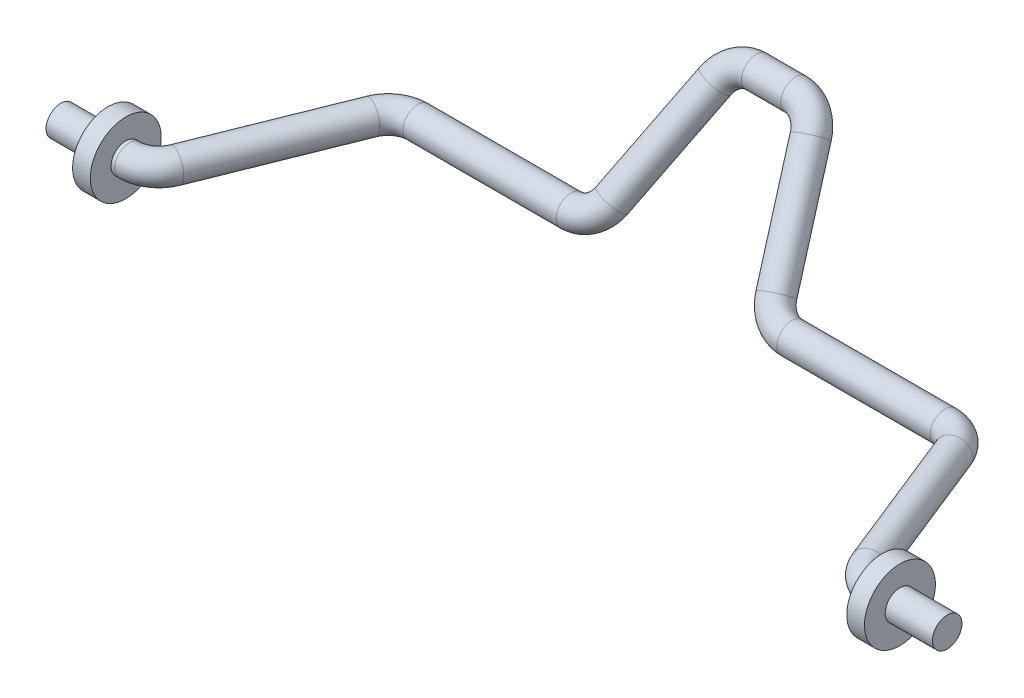
ISO-10303-21;
HEADER;
FILE_DESCRIPTION(('STEP AP214'),'2;1');
FILE_NAME('part.step','',(''),(''),'','','');
FILE_SCHEMA(('AUTOMOTIVE_DESIGN { 1 0 10303 214 1 1 1 1 }'));
ENDSEC;
DATA;
#1=APPLICATION_CONTEXT('core data for automotive mechanical design processes');
#2=APPLICATION_PROTOCOL_DEFINITION('international standard','automotive_design',2000,#1);
#3=PRODUCT_CONTEXT('',#1,'mechanical');
#4=PRODUCT('Part','Part','',(#3));
#5=PRODUCT_RELATED_PRODUCT_CATEGORY('part','',(#4));
#6=PRODUCT_DEFINITION_FORMATION('','',#4);
#7=PRODUCT_DEFINITION_CONTEXT('part definition',#1,'design');
#8=PRODUCT_DEFINITION('design','',#6,#7);
#9=PRODUCT_DEFINITION_SHAPE('','',#8);
#10=(LENGTH_UNIT() NAMED_UNIT(*) SI_UNIT(.MILLI.,.METRE.));
#11=(NAMED_UNIT(*) PLANE_ANGLE_UNIT() SI_UNIT($,.RADIAN.));
#12=(NAMED_UNIT(*) SI_UNIT($,.STERADIAN.) SOLID_ANGLE_UNIT());
#13=UNCERTAINTY_MEASURE_WITH_UNIT(LENGTH_MEASURE(1.E-05),#10,'distance_accuracy_value','');
#14=(GEOMETRIC_REPRESENTATION_CONTEXT(3) GLOBAL_UNCERTAINTY_ASSIGNED_CONTEXT((#13)) GLOBAL_UNIT_ASSIGNED_CONTEXT((#10,
#11,#12)) REPRESENTATION_CONTEXT('',''));
#15=CARTESIAN_POINT('',(0.,0.,0.));
#16=DIRECTION('',(0.,0.,1.));
#17=DIRECTION('',(1.,0.,0.));
#18=AXIS2_PLACEMENT_3D('',#15,#16,#17);
#19=CARTESIAN_POINT('',(-63.3851648071345,0.,30.));
#20=DIRECTION('',(-1.,0.,0.));
#21=DIRECTION('',(0.,0.,1.));
#22=AXIS2_PLACEMENT_3D('',#19,#20,#21);
#23=CYLINDRICAL_SURFACE('',#22,2.5);
#24=CARTESIAN_POINT('',(-63.3851648071345,0.,30.));
#25=DIRECTION('',(1.,0.,0.));
#26=DIRECTION('',(0.,0.,-1.));
#27=AXIS2_PLACEMENT_3D('',#24,#25,#26);
#28=CIRCLE('',#27,2.5);
#29=CARTESIAN_POINT('',(-63.3851648071345,0.,32.5));
#30=VERTEX_POINT('',#29);
#31=EDGE_CURVE('E50',#30,#30,#28,.T.);
#32=ORIENTED_EDGE('',*,*,#31,.F.);
#33=EDGE_LOOP('',(#32));
#34=FACE_BOUND('',#33,.T.);
#35=CARTESIAN_POINT('',(-64.,0.,30.));
#36=DIRECTION('',(-1.,0.,0.));
#37=DIRECTION('',(0.,0.,1.));
#38=AXIS2_PLACEMENT_3D('',#35,#36,#37);
#39=CIRCLE('',#38,2.5);
#40=CARTESIAN_POINT('',(-64.,0.,32.5));
#41=VERTEX_POINT('',#40);
#42=EDGE_CURVE('E10',#41,#41,#39,.T.);
#43=ORIENTED_EDGE('',*,*,#42,.F.);
#44=EDGE_LOOP('',(#43));
#45=FACE_BOUND('',#44,.T.);
#46=ADVANCED_FACE('F37',(#34,#45),#23,.T.);
#47=CARTESIAN_POINT('',(0.,20.,-16.));
#48=DIRECTION('',(-1.,0.,0.));
#49=DIRECTION('',(0.,0.,1.));
#50=AXIS2_PLACEMENT_3D('',#47,#48,#49);
#51=CYLINDRICAL_SURFACE('',#50,2.5);
#52=CARTESIAN_POINT('',(-3.32351040061422,20.,-16.));
#53=DIRECTION('',(1.,0.,0.));
#54=DIRECTION('',(0.,0.,-1.));
#55=AXIS2_PLACEMENT_3D('',#52,#53,#54);
#56=CIRCLE('',#55,2.5);
#57=CARTESIAN_POINT('',(-3.32351040061422,21.9521720236076,-17.5617376188861));
#58=VERTEX_POINT('',#57);
#59=EDGE_CURVE('E62',#58,#58,#56,.T.);
#60=ORIENTED_EDGE('',*,*,#59,.T.);
#61=EDGE_LOOP('',(#60));
#62=FACE_BOUND('',#61,.T.);
#63=CARTESIAN_POINT('',(3.32351040061422,20.,-16.));
#64=DIRECTION('',(1.,0.,0.));
#65=DIRECTION('',(0.,0.,-1.));
#66=AXIS2_PLACEMENT_3D('',#63,#64,#65);
#67=CIRCLE('',#66,2.5);
#68=CARTESIAN_POINT('',(3.32351040061422,21.9521720236076,-17.5617376188861));
#69=VERTEX_POINT('',#68);
#70=EDGE_CURVE('E190',#69,#69,#67,.T.);
#71=ORIENTED_EDGE('',*,*,#70,.F.);
#72=EDGE_LOOP('',(#71));
#73=FACE_BOUND('',#72,.T.);
#74=ADVANCED_FACE('F119',(#62,#73),#51,.T.);
#75=CARTESIAN_POINT('',(-3.32351040061422,16.0956559527848,-12.8765247622279));
#76=DIRECTION('',(0.,0.624695047554424,0.78086880944303));
#77=DIRECTION('',(0.,-0.78086880944303,0.624695047554424));
#78=AXIS2_PLACEMENT_3D('',#75,#76,#77);
#79=TOROIDAL_SURFACE('',#78,5.,2.5);
#80=CARTESIAN_POINT('',(-8.09611742170634,17.2597064457341,-13.8077651565873));
#81=DIRECTION('',(0.298142396999972,0.74535599249993,-0.596284793999944));
#82=DIRECTION('',(-0.596284793999944,-0.342369562439038,-0.72610435004877));
#83=AXIS2_PLACEMENT_3D('',#80,#81,#82);
#84=CIRCLE('',#83,2.5);
#85=CARTESIAN_POINT('',(-10.4824209322524,17.8417316922088,-14.273385353767));
#86=VERTEX_POINT('',#85);
#87=EDGE_CURVE('E69',#86,#86,#84,.T.);
#88=CARTESIAN_POINT('',(-3.32351040061422,16.0956559527848,-12.8765247622279));
#89=DIRECTION('',(0.,0.624695047554424,0.78086880944303));
#90=DIRECTION('',(0.,-0.78086880944303,0.624695047554424));
#91=AXIS2_PLACEMENT_3D('',#88,#89,#90);
#92=CIRCLE('',#91,7.5);
#93=EDGE_CURVE('',#58,#86,#92,.T.);
#94=ORIENTED_EDGE('',*,*,#59,.F.);
#95=ORIENTED_EDGE('',*,*,#87,.T.);
#96=ORIENTED_EDGE('',*,*,#93,.T.);
#97=ORIENTED_EDGE('',*,*,#93,.F.);
#98=EDGE_LOOP('',(#94,#96,#95,#97));
#99=FACE_BOUND('',#98,.T.);
#100=ADVANCED_FACE('F128',(#99),#79,.T.);
#101=CARTESIAN_POINT('',(-8.09611742170634,17.2597064457341,-13.8077651565873));
#102=DIRECTION('',(-0.298142396999972,-0.74535599249993,0.596284793999944));
#103=DIRECTION('',(0.,-0.624695047554424,-0.78086880944303));
#104=AXIS2_PLACEMENT_3D('',#101,#102,#103);
#105=CYLINDRICAL_SURFACE('',#104,2.5);
#106=CARTESIAN_POINT('',(-13.9038825782937,2.74029355426586,-2.19223484341268));
#107=DIRECTION('',(0.298142396999972,0.74535599249993,-0.596284793999944));
#108=DIRECTION('',(-0.596284793999944,-0.342369562439038,-0.72610435004877));
#109=AXIS2_PLACEMENT_3D('',#106,#107,#108);
#110=CIRCLE('',#109,2.5);
#111=CARTESIAN_POINT('',(-11.5175790677476,2.15826830779121,-1.72661464623297));
#112=VERTEX_POINT('',#111);
#113=EDGE_CURVE('E86',#112,#112,#110,.T.);
#114=ORIENTED_EDGE('',*,*,#113,.T.);
#115=EDGE_LOOP('',(#114));
#116=FACE_BOUND('',#115,.T.);
#117=ORIENTED_EDGE('',*,*,#87,.F.);
#118=EDGE_LOOP('',(#117));
#119=FACE_BOUND('',#118,.T.);
#120=ADVANCED_FACE('F159',(#116,#119),#105,.T.);
#121=CARTESIAN_POINT('',(-18.6764895993858,3.90434404721515,-3.12347523777212));
#122=DIRECTION('',(0.,-0.624695047554424,-0.78086880944303));
#123=DIRECTION('',(0.,0.78086880944303,-0.624695047554424));
#124=AXIS2_PLACEMENT_3D('',#121,#122,#123);
#125=TOROIDAL_SURFACE('',#124,5.,2.5);
#126=CARTESIAN_POINT('',(-18.6764895993858,0.,0.));
#127=DIRECTION('',(1.,0.,0.));
#128=DIRECTION('',(0.,0.,-1.));
#129=AXIS2_PLACEMENT_3D('',#126,#127,#128);
#130=CIRCLE('',#129,2.5);
#131=CARTESIAN_POINT('',(-18.6764895993857,-1.95217202360757,1.56173761888606));
#132=VERTEX_POINT('',#131);
#133=EDGE_CURVE('E90',#132,#132,#130,.T.);
#134=CARTESIAN_POINT('',(-18.6764895993858,3.90434404721515,-3.12347523777212));
#135=DIRECTION('',(0.,-0.624695047554424,-0.78086880944303));
#136=DIRECTION('',(0.,0.78086880944303,-0.624695047554424));
#137=AXIS2_PLACEMENT_3D('',#134,#135,#136);
#138=CIRCLE('',#137,7.5);
#139=EDGE_CURVE('',#112,#132,#138,.T.);
#140=ORIENTED_EDGE('',*,*,#113,.F.);
#141=ORIENTED_EDGE('',*,*,#133,.T.);
#142=ORIENTED_EDGE('',*,*,#139,.T.);
#143=ORIENTED_EDGE('',*,*,#139,.F.);
#144=EDGE_LOOP('',(#140,#142,#141,#143));
#145=FACE_BOUND('',#144,.T.);
#146=ADVANCED_FACE('F163',(#145),#125,.T.);
#147=CARTESIAN_POINT('',(-18.6764895993858,0.,0.));
#148=DIRECTION('',(-1.,0.,0.));
#149=DIRECTION('',(0.,0.,1.));
#150=AXIS2_PLACEMENT_3D('',#147,#148,#149);
#151=CYLINDRICAL_SURFACE('',#150,2.5);
#152=CARTESIAN_POINT('',(-44.6148351928655,0.,0.));
#153=DIRECTION('',(1.,0.,0.));
#154=DIRECTION('',(0.,0.,-1.));
#155=AXIS2_PLACEMENT_3D('',#152,#153,#154);
#156=CIRCLE('',#155,2.5);
#157=CARTESIAN_POINT('',(-44.6148351928655,0.,-2.5));
#158=VERTEX_POINT('',#157);
#159=EDGE_CURVE('E94',#158,#158,#156,.T.);
#160=ORIENTED_EDGE('',*,*,#159,.T.);
#161=EDGE_LOOP('',(#160));
#162=FACE_BOUND('',#161,.T.);
#163=ORIENTED_EDGE('',*,*,#133,.F.);
#164=EDGE_LOOP('',(#163));
#165=FACE_BOUND('',#164,.T.);
#166=ADVANCED_FACE('F167',(#162,#165),#151,.T.);
#167=CARTESIAN_POINT('',(-44.6148351928655,0.,5.));
#168=DIRECTION('',(0.,1.,0.));
#169=DIRECTION('',(0.,0.,1.));
#170=AXIS2_PLACEMENT_3D('',#167,#168,#169);
#171=TOROIDAL_SURFACE('',#170,5.,2.5);
#172=CARTESIAN_POINT('',(-49.2572186472918,0.,3.14304661822948));
#173=DIRECTION('',(0.371390676354103,0.,-0.92847669088526));
#174=DIRECTION('',(-0.92847669088526,0.,-0.371390676354103));
#175=AXIS2_PLACEMENT_3D('',#172,#173,#174);
#176=CIRCLE('',#175,2.5);
#177=CARTESIAN_POINT('',(-51.5784103745049,0.,2.21456992734422));
#178=VERTEX_POINT('',#177);
#179=EDGE_CURVE('E98',#178,#178,#176,.T.);
#180=CARTESIAN_POINT('',(-44.6148351928655,0.,5.));
#181=DIRECTION('',(0.,1.,0.));
#182=DIRECTION('',(0.,0.,1.));
#183=AXIS2_PLACEMENT_3D('',#180,#181,#182);
#184=CIRCLE('',#183,7.5);
#185=EDGE_CURVE('',#158,#178,#184,.T.);
#186=ORIENTED_EDGE('',*,*,#159,.F.);
#187=ORIENTED_EDGE('',*,*,#179,.T.);
#188=ORIENTED_EDGE('',*,*,#185,.T.);
#189=ORIENTED_EDGE('',*,*,#185,.F.);
#190=EDGE_LOOP('',(#186,#188,#187,#189));
#191=FACE_BOUND('',#190,.T.);
#192=ADVANCED_FACE('F120',(#191),#171,.T.);
#193=CARTESIAN_POINT('',(-49.2572186472918,0.,3.14304661822949));
#194=DIRECTION('',(-0.371390676354104,0.,0.928476690885259));
#195=DIRECTION('',(0.928476690885259,0.,0.371390676354104));
#196=AXIS2_PLACEMENT_3D('',#193,#194,#195);
#197=CYLINDRICAL_SURFACE('',#196,2.5);
#198=CARTESIAN_POINT('',(-58.7427813527082,0.,26.8569533817705));
#199=DIRECTION('',(0.371390676354104,0.,-0.928476690885259));
#200=DIRECTION('',(-0.928476690885259,0.,-0.371390676354104));
#201=AXIS2_PLACEMENT_3D('',#198,#199,#200);
#202=CIRCLE('',#201,2.5);
#203=CARTESIAN_POINT('',(-56.4215896254951,0.,27.7854300726558));
#204=VERTEX_POINT('',#203);
#205=EDGE_CURVE('E56',#204,#204,#202,.T.);
#206=ORIENTED_EDGE('',*,*,#205,.T.);
#207=EDGE_LOOP('',(#206));
#208=FACE_BOUND('',#207,.T.);
#209=ORIENTED_EDGE('',*,*,#179,.F.);
#210=EDGE_LOOP('',(#209));
#211=FACE_BOUND('',#210,.T.);
#212=ADVANCED_FACE('F105',(#208,#211),#197,.T.);
#213=CARTESIAN_POINT('',(-63.3851648071345,0.,25.));
#214=DIRECTION('',(0.,-1.,0.));
#215=DIRECTION('',(0.,0.,-1.));
#216=AXIS2_PLACEMENT_3D('',#213,#214,#215);
#217=TOROIDAL_SURFACE('',#216,4.99999999999999,2.5);
#218=CARTESIAN_POINT('',(-63.3851648071345,0.,25.));
#219=DIRECTION('',(0.,-1.,0.));
#220=DIRECTION('',(0.,0.,-1.));
#221=AXIS2_PLACEMENT_3D('',#218,#219,#220);
#222=CIRCLE('',#221,7.49999999999999);
#223=EDGE_CURVE('',#204,#30,#222,.T.);
#224=ORIENTED_EDGE('',*,*,#205,.F.);
#225=ORIENTED_EDGE('',*,*,#31,.T.);
#226=ORIENTED_EDGE('',*,*,#223,.T.);
#227=ORIENTED_EDGE('',*,*,#223,.F.);
#228=EDGE_LOOP('',(#224,#226,#225,#227));
#229=FACE_BOUND('',#228,.T.);
#230=ADVANCED_FACE('F108',(#229),#217,.T.);
#231=CARTESIAN_POINT('',(-64.,0.,30.));
#232=DIRECTION('',(-1.,0.,0.));
#233=DIRECTION('',(0.,0.,1.));
#234=AXIS2_PLACEMENT_3D('',#231,#232,#233);
#235=CYLINDRICAL_SURFACE('',#234,6.);
#236=CARTESIAN_POINT('',(-64.,0.,30.));
#237=DIRECTION('',(-1.,0.,0.));
#238=DIRECTION('',(0.,0.,1.));
#239=AXIS2_PLACEMENT_3D('',#236,#237,#238);
#240=CIRCLE('',#239,6.);
#241=CARTESIAN_POINT('',(-64.,0.,36.));
#242=VERTEX_POINT('',#241);
#243=EDGE_CURVE('E63',#242,#242,#240,.T.);
#244=ORIENTED_EDGE('',*,*,#243,.T.);
#245=EDGE_LOOP('',(#244));
#246=FACE_BOUND('',#245,.T.);
#247=CARTESIAN_POINT('',(-67.,0.,30.));
#248=DIRECTION('',(-1.,0.,0.));
#249=DIRECTION('',(0.,0.,1.));
#250=AXIS2_PLACEMENT_3D('',#247,#248,#249);
#251=CIRCLE('',#250,6.);
#252=CARTESIAN_POINT('',(-67.,0.,36.));
#253=VERTEX_POINT('',#252);
#254=EDGE_CURVE('E72',#253,#253,#251,.T.);
#255=ORIENTED_EDGE('',*,*,#254,.F.);
#256=EDGE_LOOP('',(#255));
#257=FACE_BOUND('',#256,.T.);
#258=ADVANCED_FACE('F110',(#246,#257),#235,.T.);
#259=CARTESIAN_POINT('',(-64.,0.,30.));
#260=DIRECTION('',(-1.,0.,0.));
#261=DIRECTION('',(0.,0.,1.));
#262=AXIS2_PLACEMENT_3D('',#259,#260,#261);
#263=PLANE('',#262);
#264=ORIENTED_EDGE('',*,*,#42,.T.);
#265=EDGE_LOOP('',(#264));
#266=FACE_BOUND('',#265,.T.);
#267=ORIENTED_EDGE('',*,*,#243,.F.);
#268=EDGE_LOOP('',(#267));
#269=FACE_BOUND('',#268,.T.);
#270=ADVANCED_FACE('F117',(#266,#269),#263,.F.);
#271=CARTESIAN_POINT('',(-67.,0.,30.));
#272=DIRECTION('',(-1.,0.,0.));
#273=DIRECTION('',(0.,0.,1.));
#274=AXIS2_PLACEMENT_3D('',#271,#272,#273);
#275=PLANE('',#274);
#276=CARTESIAN_POINT('',(-67.,0.,30.));
#277=DIRECTION('',(-1.,0.,0.));
#278=DIRECTION('',(0.,0.,1.));
#279=AXIS2_PLACEMENT_3D('',#276,#277,#278);
#280=CIRCLE('',#279,2.5);
#281=CARTESIAN_POINT('',(-67.,0.,32.5));
#282=VERTEX_POINT('',#281);
#283=EDGE_CURVE('E59',#282,#282,#280,.T.);
#284=ORIENTED_EDGE('',*,*,#283,.F.);
#285=EDGE_LOOP('',(#284));
#286=FACE_BOUND('',#285,.T.);
#287=ORIENTED_EDGE('',*,*,#254,.T.);
#288=EDGE_LOOP('',(#287));
#289=FACE_BOUND('',#288,.T.);
#290=ADVANCED_FACE('F143',(#286,#289),#275,.T.);
#291=CARTESIAN_POINT('',(-75.,0.,30.));
#292=DIRECTION('',(1.,0.,0.));
#293=DIRECTION('',(0.,0.,-1.));
#294=AXIS2_PLACEMENT_3D('',#291,#292,#293);
#295=PLANE('',#294);
#296=CARTESIAN_POINT('',(-75.,0.,30.));
#297=DIRECTION('',(1.,0.,0.));
#298=DIRECTION('',(0.,0.,-1.));
#299=AXIS2_PLACEMENT_3D('',#296,#297,#298);
#300=CIRCLE('',#299,2.5);
#301=CARTESIAN_POINT('',(-75.,0.,27.5));
#302=VERTEX_POINT('',#301);
#303=EDGE_CURVE('E45',#302,#302,#300,.T.);
#304=ORIENTED_EDGE('',*,*,#303,.F.);
#305=EDGE_LOOP('',(#304));
#306=FACE_BOUND('',#305,.T.);
#307=ADVANCED_FACE('F39',(#306),#295,.F.);
#308=ORIENTED_EDGE('',*,*,#283,.T.);
#309=EDGE_LOOP('',(#308));
#310=FACE_BOUND('',#309,.T.);
#311=ORIENTED_EDGE('',*,*,#303,.T.);
#312=EDGE_LOOP('',(#311));
#313=FACE_BOUND('',#312,.T.);
#314=ADVANCED_FACE('F124',(#310,#313),#23,.T.);
#315=CARTESIAN_POINT('',(63.3851648071345,0.,30.));
#316=DIRECTION('',(1.,0.,0.));
#317=DIRECTION('',(0.,0.,1.));
#318=AXIS2_PLACEMENT_3D('',#315,#316,#317);
#319=CYLINDRICAL_SURFACE('',#318,2.5);
#320=CARTESIAN_POINT('',(63.3851648071345,0.,30.));
#321=DIRECTION('',(1.,0.,0.));
#322=DIRECTION('',(0.,0.,-1.));
#323=AXIS2_PLACEMENT_3D('',#320,#321,#322);
#324=CIRCLE('',#323,2.5);
#325=CARTESIAN_POINT('',(63.3851648071345,0.,32.5));
#326=VERTEX_POINT('',#325);
#327=EDGE_CURVE('E226',#326,#326,#324,.T.);
#328=ORIENTED_EDGE('',*,*,#327,.T.);
#329=EDGE_LOOP('',(#328));
#330=FACE_BOUND('',#329,.T.);
#331=CARTESIAN_POINT('',(64.,0.,30.));
#332=DIRECTION('',(-1.,0.,0.));
#333=DIRECTION('',(0.,0.,1.));
#334=AXIS2_PLACEMENT_3D('',#331,#332,#333);
#335=CIRCLE('',#334,2.5);
#336=CARTESIAN_POINT('',(64.,0.,32.5));
#337=VERTEX_POINT('',#336);
#338=EDGE_CURVE('E78',#337,#337,#335,.T.);
#339=ORIENTED_EDGE('',*,*,#338,.T.);
#340=EDGE_LOOP('',(#339));
#341=FACE_BOUND('',#340,.T.);
#342=ADVANCED_FACE('F134',(#330,#341),#319,.T.);
#343=CARTESIAN_POINT('',(3.32351040061422,16.0956559527848,-12.8765247622279));
#344=DIRECTION('',(0.,0.624695047554424,0.78086880944303));
#345=DIRECTION('',(0.,-0.78086880944303,0.624695047554424));
#346=AXIS2_PLACEMENT_3D('',#343,#344,#345);
#347=TOROIDAL_SURFACE('',#346,5.,2.5);
#348=CARTESIAN_POINT('',(8.09611742170634,17.2597064457341,-13.8077651565873));
#349=DIRECTION('',(0.298142396999972,-0.74535599249993,0.596284793999944));
#350=DIRECTION('',(0.596284793999944,-0.342369562439038,-0.72610435004877));
#351=AXIS2_PLACEMENT_3D('',#348,#349,#350);
#352=CIRCLE('',#351,2.5);
#353=CARTESIAN_POINT('',(10.4824209322524,17.8417316922088,-14.273385353767));
#354=VERTEX_POINT('',#353);
#355=EDGE_CURVE('E193',#354,#354,#352,.T.);
#356=CARTESIAN_POINT('',(3.32351040061422,16.0956559527848,-12.8765247622279));
#357=DIRECTION('',(0.,0.624695047554424,0.78086880944303));
#358=DIRECTION('',(0.,-0.78086880944303,0.624695047554424));
#359=AXIS2_PLACEMENT_3D('',#356,#357,#358);
#360=CIRCLE('',#359,7.5);
#361=EDGE_CURVE('',#354,#69,#360,.T.);
#362=ORIENTED_EDGE('',*,*,#355,.F.);
#363=ORIENTED_EDGE('',*,*,#70,.T.);
#364=ORIENTED_EDGE('',*,*,#361,.T.);
#365=ORIENTED_EDGE('',*,*,#361,.F.);
#366=EDGE_LOOP('',(#362,#364,#363,#365));
#367=FACE_BOUND('',#366,.T.);
#368=ADVANCED_FACE('F139',(#367),#347,.T.);
#369=CARTESIAN_POINT('',(8.09611742170634,17.2597064457341,-13.8077651565873));
#370=DIRECTION('',(0.298142396999972,-0.74535599249993,0.596284793999944));
#371=DIRECTION('',(0.,-0.624695047554424,-0.78086880944303));
#372=AXIS2_PLACEMENT_3D('',#369,#370,#371);
#373=CYLINDRICAL_SURFACE('',#372,2.5);
#374=CARTESIAN_POINT('',(13.9038825782937,2.74029355426586,-2.19223484341268));
#375=DIRECTION('',(0.298142396999972,-0.74535599249993,0.596284793999944));
#376=DIRECTION('',(0.596284793999944,-0.342369562439038,-0.72610435004877));
#377=AXIS2_PLACEMENT_3D('',#374,#375,#376);
#378=CIRCLE('',#377,2.5);
#379=CARTESIAN_POINT('',(11.5175790677476,2.15826830779121,-1.72661464623297));
#380=VERTEX_POINT('',#379);
#381=EDGE_CURVE('E199',#380,#380,#378,.T.);
#382=ORIENTED_EDGE('',*,*,#381,.F.);
#383=EDGE_LOOP('',(#382));
#384=FACE_BOUND('',#383,.T.);
#385=ORIENTED_EDGE('',*,*,#355,.T.);
#386=EDGE_LOOP('',(#385));
#387=FACE_BOUND('',#386,.T.);
#388=ADVANCED_FACE('F268',(#384,#387),#373,.T.);
#389=CARTESIAN_POINT('',(18.6764895993858,3.90434404721515,-3.12347523777212));
#390=DIRECTION('',(0.,-0.624695047554424,-0.78086880944303));
#391=DIRECTION('',(0.,0.78086880944303,-0.624695047554424));
#392=AXIS2_PLACEMENT_3D('',#389,#390,#391);
#393=TOROIDAL_SURFACE('',#392,5.,2.5);
#394=CARTESIAN_POINT('',(18.6764895993858,0.,0.));
#395=DIRECTION('',(1.,0.,0.));
#396=DIRECTION('',(0.,0.,-1.));
#397=AXIS2_PLACEMENT_3D('',#394,#395,#396);
#398=CIRCLE('',#397,2.5);
#399=CARTESIAN_POINT('',(18.6764895993857,-1.95217202360757,1.56173761888606));
#400=VERTEX_POINT('',#399);
#401=EDGE_CURVE('E210',#400,#400,#398,.T.);
#402=CARTESIAN_POINT('',(18.6764895993858,3.90434404721515,-3.12347523777212));
#403=DIRECTION('',(0.,-0.624695047554424,-0.78086880944303));
#404=DIRECTION('',(0.,0.78086880944303,-0.624695047554424));
#405=AXIS2_PLACEMENT_3D('',#402,#403,#404);
#406=CIRCLE('',#405,7.5);
#407=EDGE_CURVE('',#400,#380,#406,.T.);
#408=ORIENTED_EDGE('',*,*,#401,.F.);
#409=ORIENTED_EDGE('',*,*,#381,.T.);
#410=ORIENTED_EDGE('',*,*,#407,.T.);
#411=ORIENTED_EDGE('',*,*,#407,.F.);
#412=EDGE_LOOP('',(#408,#410,#409,#411));
#413=FACE_BOUND('',#412,.T.);
#414=ADVANCED_FACE('F272',(#413),#393,.T.);
#415=CARTESIAN_POINT('',(18.6764895993858,0.,0.));
#416=DIRECTION('',(1.,0.,0.));
#417=DIRECTION('',(0.,0.,1.));
#418=AXIS2_PLACEMENT_3D('',#415,#416,#417);
#419=CYLINDRICAL_SURFACE('',#418,2.5);
#420=CARTESIAN_POINT('',(44.6148351928655,0.,0.));
#421=DIRECTION('',(1.,0.,0.));
#422=DIRECTION('',(0.,0.,-1.));
#423=AXIS2_PLACEMENT_3D('',#420,#421,#422);
#424=CIRCLE('',#423,2.5);
#425=CARTESIAN_POINT('',(44.6148351928655,0.,-2.5));
#426=VERTEX_POINT('',#425);
#427=EDGE_CURVE('E214',#426,#426,#424,.T.);
#428=ORIENTED_EDGE('',*,*,#427,.F.);
#429=EDGE_LOOP('',(#428));
#430=FACE_BOUND('',#429,.T.);
#431=ORIENTED_EDGE('',*,*,#401,.T.);
#432=EDGE_LOOP('',(#431));
#433=FACE_BOUND('',#432,.T.);
#434=ADVANCED_FACE('F276',(#430,#433),#419,.T.);
#435=CARTESIAN_POINT('',(44.6148351928655,0.,5.));
#436=DIRECTION('',(0.,1.,0.));
#437=DIRECTION('',(0.,0.,1.));
#438=AXIS2_PLACEMENT_3D('',#435,#436,#437);
#439=TOROIDAL_SURFACE('',#438,5.,2.5);
#440=CARTESIAN_POINT('',(49.2572186472918,0.,3.14304661822948));
#441=DIRECTION('',(0.371390676354103,0.,0.92847669088526));
#442=DIRECTION('',(0.92847669088526,0.,-0.371390676354103));
#443=AXIS2_PLACEMENT_3D('',#440,#441,#442);
#444=CIRCLE('',#443,2.5);
#445=CARTESIAN_POINT('',(51.5784103745049,0.,2.21456992734422));
#446=VERTEX_POINT('',#445);
#447=EDGE_CURVE('E218',#446,#446,#444,.T.);
#448=CARTESIAN_POINT('',(44.6148351928655,0.,5.));
#449=DIRECTION('',(0.,1.,0.));
#450=DIRECTION('',(0.,0.,1.));
#451=AXIS2_PLACEMENT_3D('',#448,#449,#450);
#452=CIRCLE('',#451,7.5);
#453=EDGE_CURVE('',#446,#426,#452,.T.);
#454=ORIENTED_EDGE('',*,*,#447,.F.);
#455=ORIENTED_EDGE('',*,*,#427,.T.);
#456=ORIENTED_EDGE('',*,*,#453,.T.);
#457=ORIENTED_EDGE('',*,*,#453,.F.);
#458=EDGE_LOOP('',(#454,#456,#455,#457));
#459=FACE_BOUND('',#458,.T.);
#460=ADVANCED_FACE('F280',(#459),#439,.T.);
#461=CARTESIAN_POINT('',(49.2572186472918,0.,3.14304661822949));
#462=DIRECTION('',(0.371390676354104,0.,0.928476690885259));
#463=DIRECTION('',(-0.928476690885259,0.,0.371390676354104));
#464=AXIS2_PLACEMENT_3D('',#461,#462,#463);
#465=CYLINDRICAL_SURFACE('',#464,2.5);
#466=CARTESIAN_POINT('',(58.7427813527082,0.,26.8569533817705));
#467=DIRECTION('',(0.371390676354104,0.,0.928476690885259));
#468=DIRECTION('',(0.928476690885259,0.,-0.371390676354104));
#469=AXIS2_PLACEMENT_3D('',#466,#467,#468);
#470=CIRCLE('',#469,2.5);
#471=CARTESIAN_POINT('',(56.4215896254951,0.,27.7854300726558));
#472=VERTEX_POINT('',#471);
#473=EDGE_CURVE('E222',#472,#472,#470,.T.);
#474=ORIENTED_EDGE('',*,*,#473,.F.);
#475=EDGE_LOOP('',(#474));
#476=FACE_BOUND('',#475,.T.);
#477=ORIENTED_EDGE('',*,*,#447,.T.);
#478=EDGE_LOOP('',(#477));
#479=FACE_BOUND('',#478,.T.);
#480=ADVANCED_FACE('F284',(#476,#479),#465,.T.);
#481=CARTESIAN_POINT('',(63.3851648071345,0.,25.));
#482=DIRECTION('',(0.,-1.,0.));
#483=DIRECTION('',(0.,0.,-1.));
#484=AXIS2_PLACEMENT_3D('',#481,#482,#483);
#485=TOROIDAL_SURFACE('',#484,4.99999999999999,2.5);
#486=CARTESIAN_POINT('',(63.3851648071345,0.,25.));
#487=DIRECTION('',(0.,-1.,0.));
#488=DIRECTION('',(0.,0.,-1.));
#489=AXIS2_PLACEMENT_3D('',#486,#487,#488);
#490=CIRCLE('',#489,7.49999999999999);
#491=EDGE_CURVE('',#326,#472,#490,.T.);
#492=ORIENTED_EDGE('',*,*,#327,.F.);
#493=ORIENTED_EDGE('',*,*,#473,.T.);
#494=ORIENTED_EDGE('',*,*,#491,.T.);
#495=ORIENTED_EDGE('',*,*,#491,.F.);
#496=EDGE_LOOP('',(#492,#494,#493,#495));
#497=FACE_BOUND('',#496,.T.);
#498=ADVANCED_FACE('F265',(#497),#485,.T.);
#499=CARTESIAN_POINT('',(64.,0.,30.));
#500=DIRECTION('',(1.,0.,0.));
#501=DIRECTION('',(0.,0.,1.));
#502=AXIS2_PLACEMENT_3D('',#499,#500,#501);
#503=CYLINDRICAL_SURFACE('',#502,6.);
#504=CARTESIAN_POINT('',(64.,0.,30.));
#505=DIRECTION('',(-1.,0.,0.));
#506=DIRECTION('',(0.,0.,1.));
#507=AXIS2_PLACEMENT_3D('',#504,#505,#506);
#508=CIRCLE('',#507,6.);
#509=CARTESIAN_POINT('',(64.,0.,36.));
#510=VERTEX_POINT('',#509);
#511=EDGE_CURVE('E202',#510,#510,#508,.T.);
#512=ORIENTED_EDGE('',*,*,#511,.F.);
#513=EDGE_LOOP('',(#512));
#514=FACE_BOUND('',#513,.T.);
#515=CARTESIAN_POINT('',(67.,0.,30.));
#516=DIRECTION('',(-1.,0.,0.));
#517=DIRECTION('',(0.,0.,1.));
#518=AXIS2_PLACEMENT_3D('',#515,#516,#517);
#519=CIRCLE('',#518,6.);
#520=CARTESIAN_POINT('',(67.,0.,36.));
#521=VERTEX_POINT('',#520);
#522=EDGE_CURVE('E204',#521,#521,#519,.T.);
#523=ORIENTED_EDGE('',*,*,#522,.T.);
#524=EDGE_LOOP('',(#523));
#525=FACE_BOUND('',#524,.T.);
#526=ADVANCED_FACE('F244',(#514,#525),#503,.T.);
#527=CARTESIAN_POINT('',(64.,0.,30.));
#528=DIRECTION('',(1.,0.,0.));
#529=DIRECTION('',(0.,0.,1.));
#530=AXIS2_PLACEMENT_3D('',#527,#528,#529);
#531=PLANE('',#530);
#532=ORIENTED_EDGE('',*,*,#338,.F.);
#533=EDGE_LOOP('',(#532));
#534=FACE_BOUND('',#533,.T.);
#535=ORIENTED_EDGE('',*,*,#511,.T.);
#536=EDGE_LOOP('',(#535));
#537=FACE_BOUND('',#536,.T.);
#538=ADVANCED_FACE('F240',(#534,#537),#531,.F.);
#539=CARTESIAN_POINT('',(67.,0.,30.));
#540=DIRECTION('',(1.,0.,0.));
#541=DIRECTION('',(0.,0.,1.));
#542=AXIS2_PLACEMENT_3D('',#539,#540,#541);
#543=PLANE('',#542);
#544=CARTESIAN_POINT('',(67.,0.,30.));
#545=DIRECTION('',(-1.,0.,0.));
#546=DIRECTION('',(0.,0.,1.));
#547=AXIS2_PLACEMENT_3D('',#544,#545,#546);
#548=CIRCLE('',#547,2.5);
#549=CARTESIAN_POINT('',(67.,0.,32.5));
#550=VERTEX_POINT('',#549);
#551=EDGE_CURVE('E194',#550,#550,#548,.T.);
#552=ORIENTED_EDGE('',*,*,#551,.T.);
#553=EDGE_LOOP('',(#552));
#554=FACE_BOUND('',#553,.T.);
#555=ORIENTED_EDGE('',*,*,#522,.F.);
#556=EDGE_LOOP('',(#555));
#557=FACE_BOUND('',#556,.T.);
#558=ADVANCED_FACE('F243',(#554,#557),#543,.T.);
#559=CARTESIAN_POINT('',(75.,0.,30.));
#560=DIRECTION('',(-1.,0.,0.));
#561=DIRECTION('',(0.,0.,-1.));
#562=AXIS2_PLACEMENT_3D('',#559,#560,#561);
#563=PLANE('',#562);
#564=CARTESIAN_POINT('',(75.,0.,30.));
#565=DIRECTION('',(1.,0.,0.));
#566=DIRECTION('',(0.,0.,-1.));
#567=AXIS2_PLACEMENT_3D('',#564,#565,#566);
#568=CIRCLE('',#567,2.5);
#569=CARTESIAN_POINT('',(75.,0.,27.5));
#570=VERTEX_POINT('',#569);
#571=EDGE_CURVE('E230',#570,#570,#568,.T.);
#572=ORIENTED_EDGE('',*,*,#571,.T.);
#573=EDGE_LOOP('',(#572));
#574=FACE_BOUND('',#573,.T.);
#575=ADVANCED_FACE('F256',(#574),#563,.F.);
#576=ORIENTED_EDGE('',*,*,#551,.F.);
#577=EDGE_LOOP('',(#576));
#578=FACE_BOUND('',#577,.T.);
#579=ORIENTED_EDGE('',*,*,#571,.F.);
#580=EDGE_LOOP('',(#579));
#581=FACE_BOUND('',#580,.T.);
#582=ADVANCED_FACE('F142',(#578,#581),#319,.T.);
#583=CLOSED_SHELL('',(#46,#74,#100,#120,#146,#166,#192,#212,#230,#258,#270,#290,#307,#314,#342,
#368,#388,#414,#434,#460,#480,#498,#526,#538,#558,#575,#582));
#584=MANIFOLD_SOLID_BREP('B2',#583);
#585=ADVANCED_BREP_SHAPE_REPRESENTATION('',(#18,#584),#14);
#586=SHAPE_DEFINITION_REPRESENTATION(#9,#585);
ENDSEC;
END-ISO-10303-21;
